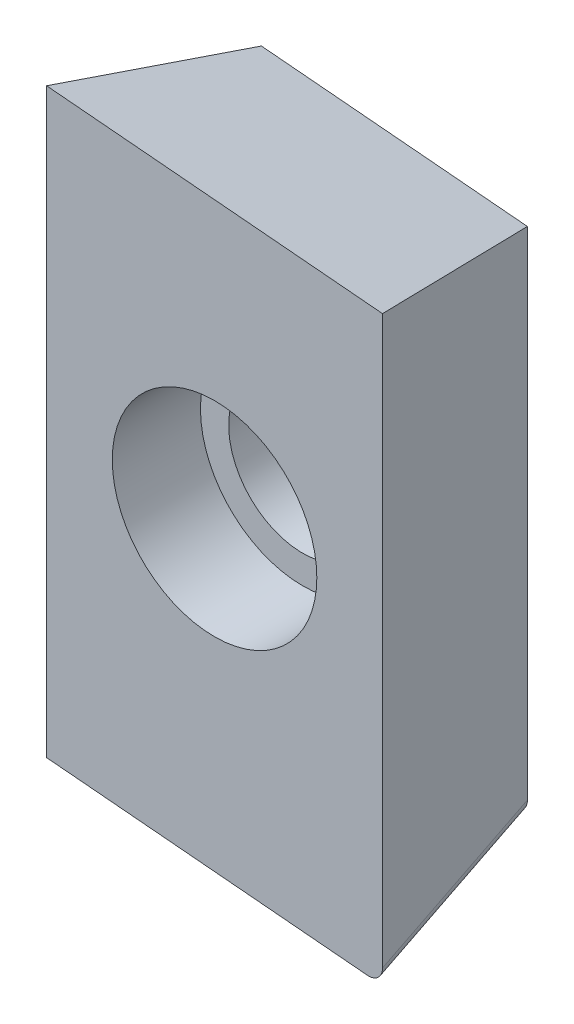
ISO-10303-21;
HEADER;
FILE_DESCRIPTION(('STEP AP214'),'2;1');
FILE_NAME('part.step','',(''),(''),'','','');
FILE_SCHEMA(('AUTOMOTIVE_DESIGN { 1 0 10303 214 1 1 1 1 }'));
ENDSEC;
DATA;
#1=APPLICATION_CONTEXT('core data for automotive mechanical design processes');
#2=APPLICATION_PROTOCOL_DEFINITION('international standard','automotive_design',2000,#1);
#3=PRODUCT_CONTEXT('',#1,'mechanical');
#4=PRODUCT('Part','Part','',(#3));
#5=PRODUCT_RELATED_PRODUCT_CATEGORY('part','',(#4));
#6=PRODUCT_DEFINITION_FORMATION('','',#4);
#7=PRODUCT_DEFINITION_CONTEXT('part definition',#1,'design');
#8=PRODUCT_DEFINITION('design','',#6,#7);
#9=PRODUCT_DEFINITION_SHAPE('','',#8);
#10=(LENGTH_UNIT() NAMED_UNIT(*) SI_UNIT(.MILLI.,.METRE.));
#11=(NAMED_UNIT(*) PLANE_ANGLE_UNIT() SI_UNIT($,.RADIAN.));
#12=(NAMED_UNIT(*) SI_UNIT($,.STERADIAN.) SOLID_ANGLE_UNIT());
#13=UNCERTAINTY_MEASURE_WITH_UNIT(LENGTH_MEASURE(1.E-05),#10,'distance_accuracy_value','');
#14=(GEOMETRIC_REPRESENTATION_CONTEXT(3) GLOBAL_UNCERTAINTY_ASSIGNED_CONTEXT((#13)) GLOBAL_UNIT_ASSIGNED_CONTEXT((#10,
#11,#12)) REPRESENTATION_CONTEXT('',''));
#15=CARTESIAN_POINT('',(0.,0.,0.));
#16=DIRECTION('',(0.,0.,1.));
#17=DIRECTION('',(1.,0.,0.));
#18=AXIS2_PLACEMENT_3D('',#15,#16,#17);
#19=CARTESIAN_POINT('',(0.,0.,0.));
#20=DIRECTION('',(0.,0.,1.));
#21=DIRECTION('',(1.,0.,0.));
#22=AXIS2_PLACEMENT_3D('',#19,#20,#21);
#23=PLANE('',#22);
#24=CARTESIAN_POINT('',(4.7625,-8.25,0.));
#25=DIRECTION('',(0.,0.,1.));
#26=DIRECTION('',(1.,0.,0.));
#27=AXIS2_PLACEMENT_3D('',#24,#25,#26);
#28=CIRCLE('',#27,2.1);
#29=CARTESIAN_POINT('',(6.8625,-8.25,0.));
#30=VERTEX_POINT('',#29);
#31=EDGE_CURVE('E128',#30,#30,#28,.T.);
#32=ORIENTED_EDGE('',*,*,#31,.T.);
#33=EDGE_LOOP('',(#32));
#34=FACE_BOUND('',#33,.T.);
#35=DIRECTION('',(0.,-1.,0.));
#36=VECTOR('',#35,1.);
#37=CARTESIAN_POINT('',(8.53366042339765,0.,0.));
#38=LINE('',#37,#36);
#39=CARTESIAN_POINT('',(8.53366042339765,-1.73793812202938,0.));
#40=VERTEX_POINT('',#39);
#41=CARTESIAN_POINT('',(8.53366042339765,-15.8267556288412,0.));
#42=VERTEX_POINT('',#41);
#43=EDGE_CURVE('E106',#40,#42,#38,.T.);
#44=ORIENTED_EDGE('',*,*,#43,.T.);
#45=CARTESIAN_POINT('',(8.12617374541557,-15.8106218595211,0.));
#46=DIRECTION('',(0.,0.,1.));
#47=DIRECTION('',(0.676877037663269,-0.736096105059793,0.));
#48=AXIS2_PLACEMENT_3D('',#45,#46,#47);
#49=ELLIPSE('',#48,0.416166871786625,0.4);
#50=CARTESIAN_POINT('',(8.10672862773424,-16.2179072766054,0.));
#51=VERTEX_POINT('',#50);
#52=EDGE_CURVE('E11',#42,#51,#49,.F.);
#53=ORIENTED_EDGE('',*,*,#52,.T.);
#54=DIRECTION('',(0.996194698091747,-0.0871557427476442,0.));
#55=VECTOR('',#54,1.);
#56=CARTESIAN_POINT('',(-1.01875649516566,-15.4195307791773,0.));
#57=LINE('',#56,#55);
#58=CARTESIAN_POINT('',(0.991339576602346,-15.595391398055,0.));
#59=VERTEX_POINT('',#58);
#60=EDGE_CURVE('E86',#59,#51,#57,.T.);
#61=ORIENTED_EDGE('',*,*,#60,.F.);
#62=DIRECTION('',(0.,1.,0.));
#63=VECTOR('',#62,1.);
#64=CARTESIAN_POINT('',(0.991339576602346,0.,0.));
#65=LINE('',#64,#63);
#66=CARTESIAN_POINT('',(0.991339576602346,-1.07807055125965,0.));
#67=VERTEX_POINT('',#66);
#68=EDGE_CURVE('E97',#59,#67,#65,.T.);
#69=ORIENTED_EDGE('',*,*,#68,.T.);
#70=DIRECTION('',(-0.996194698091747,0.0871557427476448,0.));
#71=VECTOR('',#70,1.);
#72=CARTESIAN_POINT('',(10.5437564951657,-1.91379874090705,0.));
#73=LINE('',#72,#71);
#74=EDGE_CURVE('E93',#40,#67,#73,.T.);
#75=ORIENTED_EDGE('',*,*,#74,.F.);
#76=EDGE_LOOP('',(#44,#53,#61,#69,#75));
#77=FACE_BOUND('',#76,.T.);
#78=ADVANCED_FACE('F36',(#34,#77),#23,.F.);
#79=CARTESIAN_POINT('',(9.525,-18.25,5.1));
#80=DIRECTION('',(-0.981627183447665,0.,0.190808995376542));
#81=DIRECTION('',(0.190808995376542,0.,0.981627183447665));
#82=AXIS2_PLACEMENT_3D('',#79,#80,#81);
#83=PLANE('',#82);
#84=DIRECTION('',(0.,1.,0.));
#85=VECTOR('',#84,1.);
#86=CARTESIAN_POINT('',(9.525,-0.833329520084297,5.1));
#87=LINE('',#86,#85);
#88=CARTESIAN_POINT('',(9.525,-16.9048261801008,5.1));
#89=VERTEX_POINT('',#88);
#90=CARTESIAN_POINT('',(9.525,-0.833329520084297,5.1));
#91=VERTEX_POINT('',#90);
#92=EDGE_CURVE('E115',#89,#91,#87,.T.);
#93=ORIENTED_EDGE('',*,*,#92,.F.);
#94=DIRECTION('',(0.186829199838258,-0.203174636839719,0.961152910328447));
#95=VECTOR('',#94,1.);
#96=CARTESIAN_POINT('',(9.57606139226562,-16.9603548653335,5.36268809064114));
#97=LINE('',#96,#95);
#98=EDGE_CURVE('E44',#89,#42,#97,.F.);
#99=ORIENTED_EDGE('',*,*,#98,.T.);
#100=ORIENTED_EDGE('',*,*,#43,.F.);
#101=DIRECTION('',(0.187980841165925,0.171534648603845,0.967077591345651));
#102=VECTOR('',#101,1.);
#103=CARTESIAN_POINT('',(9.55812558544302,-0.8031020478402,5.27041636362225));
#104=LINE('',#103,#102);
#105=EDGE_CURVE('E120',#40,#91,#104,.T.);
#106=ORIENTED_EDGE('',*,*,#105,.T.);
#107=EDGE_LOOP('',(#93,#99,#100,#106));
#108=FACE_BOUND('',#107,.T.);
#109=ADVANCED_FACE('F162',(#108),#83,.F.);
#110=CARTESIAN_POINT('',(0.,-18.25,5.1));
#111=DIRECTION('',(0.981627183447665,0.,0.190808995376542));
#112=DIRECTION('',(0.190808995376542,0.,-0.981627183447665));
#113=AXIS2_PLACEMENT_3D('',#110,#111,#112);
#114=PLANE('',#113);
#115=DIRECTION('',(0.187980841165925,0.171534648603838,-0.967077591345653));
#116=VECTOR('',#115,1.);
#117=CARTESIAN_POINT('',(0.925979886146384,-15.6550328565445,0.336246458017804));
#118=LINE('',#117,#116);
#119=CARTESIAN_POINT('',(0.,-16.5,5.1));
#120=VERTEX_POINT('',#119);
#121=EDGE_CURVE('E82',#120,#59,#118,.T.);
#122=ORIENTED_EDGE('',*,*,#121,.F.);
#123=DIRECTION('',(0.,-1.,0.));
#124=VECTOR('',#123,1.);
#125=CARTESIAN_POINT('',(0.,0.,5.1));
#126=LINE('',#125,#124);
#127=CARTESIAN_POINT('',(0.,0.,5.1));
#128=VERTEX_POINT('',#127);
#129=EDGE_CURVE('E118',#128,#120,#126,.T.);
#130=ORIENTED_EDGE('',*,*,#129,.F.);
#131=DIRECTION('',(0.186829199838258,-0.203174636839726,-0.961152910328446));
#132=VECTOR('',#131,1.);
#133=CARTESIAN_POINT('',(0.403046986850224,-0.438309029067903,3.02650300517491));
#134=LINE('',#133,#132);
#135=EDGE_CURVE('E104',#128,#67,#134,.T.);
#136=ORIENTED_EDGE('',*,*,#135,.T.);
#137=ORIENTED_EDGE('',*,*,#68,.F.);
#138=EDGE_LOOP('',(#122,#130,#136,#137));
#139=FACE_BOUND('',#138,.T.);
#140=ADVANCED_FACE('F103',(#139),#114,.F.);
#141=CARTESIAN_POINT('',(0.,0.,5.1));
#142=DIRECTION('',(0.,0.,1.));
#143=DIRECTION('',(1.,0.,0.));
#144=AXIS2_PLACEMENT_3D('',#141,#142,#143);
#145=PLANE('',#144);
#146=CARTESIAN_POINT('',(4.7625,-8.25,5.1));
#147=DIRECTION('',(0.,0.,1.));
#148=DIRECTION('',(1.,0.,0.));
#149=AXIS2_PLACEMENT_3D('',#146,#147,#148);
#150=CIRCLE('',#149,2.9);
#151=CARTESIAN_POINT('',(7.6625,-8.25,5.1));
#152=VERTEX_POINT('',#151);
#153=EDGE_CURVE('E125',#152,#152,#150,.T.);
#154=ORIENTED_EDGE('',*,*,#153,.F.);
#155=EDGE_LOOP('',(#154));
#156=FACE_BOUND('',#155,.T.);
#157=DIRECTION('',(0.996194698091747,-0.0871557427476446,0.));
#158=VECTOR('',#157,1.);
#159=CARTESIAN_POINT('',(0.,-16.5,5.1));
#160=LINE('',#159,#158);
#161=CARTESIAN_POINT('',(9.09806820433659,-17.295977827865,5.1));
#162=VERTEX_POINT('',#161);
#163=EDGE_CURVE('E88',#120,#162,#160,.T.);
#164=ORIENTED_EDGE('',*,*,#163,.T.);
#165=CARTESIAN_POINT('',(9.11751332201792,-16.8886924107807,5.1));
#166=DIRECTION('',(0.,0.,1.));
#167=DIRECTION('',(0.676877037663269,-0.736096105059793,0.));
#168=AXIS2_PLACEMENT_3D('',#165,#166,#167);
#169=ELLIPSE('',#168,0.416166871786625,0.4);
#170=EDGE_CURVE('E58',#162,#89,#169,.T.);
#171=ORIENTED_EDGE('',*,*,#170,.T.);
#172=ORIENTED_EDGE('',*,*,#92,.T.);
#173=DIRECTION('',(-0.996194698091747,0.0871557427476447,0.));
#174=VECTOR('',#173,1.);
#175=CARTESIAN_POINT('',(0.,0.,5.1));
#176=LINE('',#175,#174);
#177=EDGE_CURVE('E109',#91,#128,#176,.T.);
#178=ORIENTED_EDGE('',*,*,#177,.T.);
#179=ORIENTED_EDGE('',*,*,#129,.T.);
#180=EDGE_LOOP('',(#164,#171,#172,#178,#179));
#181=FACE_BOUND('',#180,.T.);
#182=ADVANCED_FACE('F156',(#156,#181),#145,.T.);
#183=CARTESIAN_POINT('',(10.5437564951657,-0.922459164304681,5.1));
#184=DIRECTION('',(0.0855662792071985,0.978027046691111,-0.190109199680868));
#185=DIRECTION('',(0.,0.190808995376545,0.981627183447664));
#186=AXIS2_PLACEMENT_3D('',#183,#184,#185);
#187=PLANE('',#186);
#188=ORIENTED_EDGE('',*,*,#177,.F.);
#189=ORIENTED_EDGE('',*,*,#105,.F.);
#190=ORIENTED_EDGE('',*,*,#74,.T.);
#191=ORIENTED_EDGE('',*,*,#135,.F.);
#192=EDGE_LOOP('',(#188,#189,#190,#191));
#193=FACE_BOUND('',#192,.T.);
#194=ADVANCED_FACE('F158',(#193),#187,.T.);
#195=CARTESIAN_POINT('',(-1.01875649516566,-15.4195307791773,0.));
#196=DIRECTION('',(0.085566279207198,0.978027046691112,0.190109199680861));
#197=DIRECTION('',(0.,-0.190808995376538,0.981627183447665));
#198=AXIS2_PLACEMENT_3D('',#195,#196,#197);
#199=PLANE('',#198);
#200=ORIENTED_EDGE('',*,*,#60,.T.);
#201=DIRECTION('',(0.186829199838258,-0.203174636839719,0.961152910328447));
#202=VECTOR('',#201,1.);
#203=CARTESIAN_POINT('',(7.75789666409607,-15.8385564706734,-1.79458487943359));
#204=LINE('',#203,#202);
#205=EDGE_CURVE('E105',#51,#162,#204,.T.);
#206=ORIENTED_EDGE('',*,*,#205,.T.);
#207=ORIENTED_EDGE('',*,*,#163,.F.);
#208=ORIENTED_EDGE('',*,*,#121,.T.);
#209=EDGE_LOOP('',(#200,#206,#207,#208));
#210=FACE_BOUND('',#209,.T.);
#211=ADVANCED_FACE('F84',(#210),#199,.F.);
#212=CARTESIAN_POINT('',(7.79212317577895,-15.4473456519969,-1.71854119956125));
#213=DIRECTION('',(0.186829199838258,-0.203174636839719,0.961152910328447));
#214=DIRECTION('',(0.,-0.978379819631545,-0.206816170880678));
#215=AXIS2_PLACEMENT_3D('',#212,#213,#214);
#216=CYLINDRICAL_SURFACE('',#215,0.4);
#217=ORIENTED_EDGE('',*,*,#52,.F.);
#218=ORIENTED_EDGE('',*,*,#98,.F.);
#219=ORIENTED_EDGE('',*,*,#170,.F.);
#220=ORIENTED_EDGE('',*,*,#205,.F.);
#221=EDGE_LOOP('',(#217,#218,#219,#220));
#222=FACE_BOUND('',#221,.T.);
#223=ADVANCED_FACE('F38',(#222),#216,.T.);
#224=CARTESIAN_POINT('',(4.7625,-8.25,2.6));
#225=DIRECTION('',(0.,0.,1.));
#226=DIRECTION('',(1.,0.,0.));
#227=AXIS2_PLACEMENT_3D('',#224,#225,#226);
#228=CYLINDRICAL_SURFACE('',#227,2.9);
#229=CARTESIAN_POINT('',(4.7625,-8.25,2.6));
#230=DIRECTION('',(0.,0.,1.));
#231=DIRECTION('',(1.,0.,0.));
#232=AXIS2_PLACEMENT_3D('',#229,#230,#231);
#233=CIRCLE('',#232,2.9);
#234=CARTESIAN_POINT('',(7.6625,-8.25,2.6));
#235=VERTEX_POINT('',#234);
#236=EDGE_CURVE('E100',#235,#235,#233,.T.);
#237=ORIENTED_EDGE('',*,*,#236,.F.);
#238=EDGE_LOOP('',(#237));
#239=FACE_BOUND('',#238,.T.);
#240=ORIENTED_EDGE('',*,*,#153,.T.);
#241=EDGE_LOOP('',(#240));
#242=FACE_BOUND('',#241,.T.);
#243=ADVANCED_FACE('F147',(#239,#242),#228,.F.);
#244=CARTESIAN_POINT('',(4.7625,-8.25,2.6));
#245=DIRECTION('',(0.,0.,1.));
#246=DIRECTION('',(1.,0.,0.));
#247=AXIS2_PLACEMENT_3D('',#244,#245,#246);
#248=PLANE('',#247);
#249=CARTESIAN_POINT('',(4.7625,-8.25,2.6));
#250=DIRECTION('',(0.,0.,1.));
#251=DIRECTION('',(1.,0.,0.));
#252=AXIS2_PLACEMENT_3D('',#249,#250,#251);
#253=CIRCLE('',#252,2.1);
#254=CARTESIAN_POINT('',(6.8625,-8.25,2.6));
#255=VERTEX_POINT('',#254);
#256=EDGE_CURVE('E131',#255,#255,#253,.T.);
#257=ORIENTED_EDGE('',*,*,#256,.F.);
#258=EDGE_LOOP('',(#257));
#259=FACE_BOUND('',#258,.T.);
#260=ORIENTED_EDGE('',*,*,#236,.T.);
#261=EDGE_LOOP('',(#260));
#262=FACE_BOUND('',#261,.T.);
#263=ADVANCED_FACE('F141',(#259,#262),#248,.T.);
#264=CARTESIAN_POINT('',(4.7625,-8.25,0.));
#265=DIRECTION('',(0.,0.,1.));
#266=DIRECTION('',(1.,0.,0.));
#267=AXIS2_PLACEMENT_3D('',#264,#265,#266);
#268=CYLINDRICAL_SURFACE('',#267,2.1);
#269=ORIENTED_EDGE('',*,*,#31,.F.);
#270=EDGE_LOOP('',(#269));
#271=FACE_BOUND('',#270,.T.);
#272=ORIENTED_EDGE('',*,*,#256,.T.);
#273=EDGE_LOOP('',(#272));
#274=FACE_BOUND('',#273,.T.);
#275=ADVANCED_FACE('F138',(#271,#274),#268,.F.);
#276=CLOSED_SHELL('',(#78,#109,#140,#182,#194,#211,#223,#243,#263,#275));
#277=MANIFOLD_SOLID_BREP('B2',#276);
#278=ADVANCED_BREP_SHAPE_REPRESENTATION('',(#18,#277),#14);
#279=SHAPE_DEFINITION_REPRESENTATION(#9,#278);
ENDSEC;
END-ISO-10303-21;
